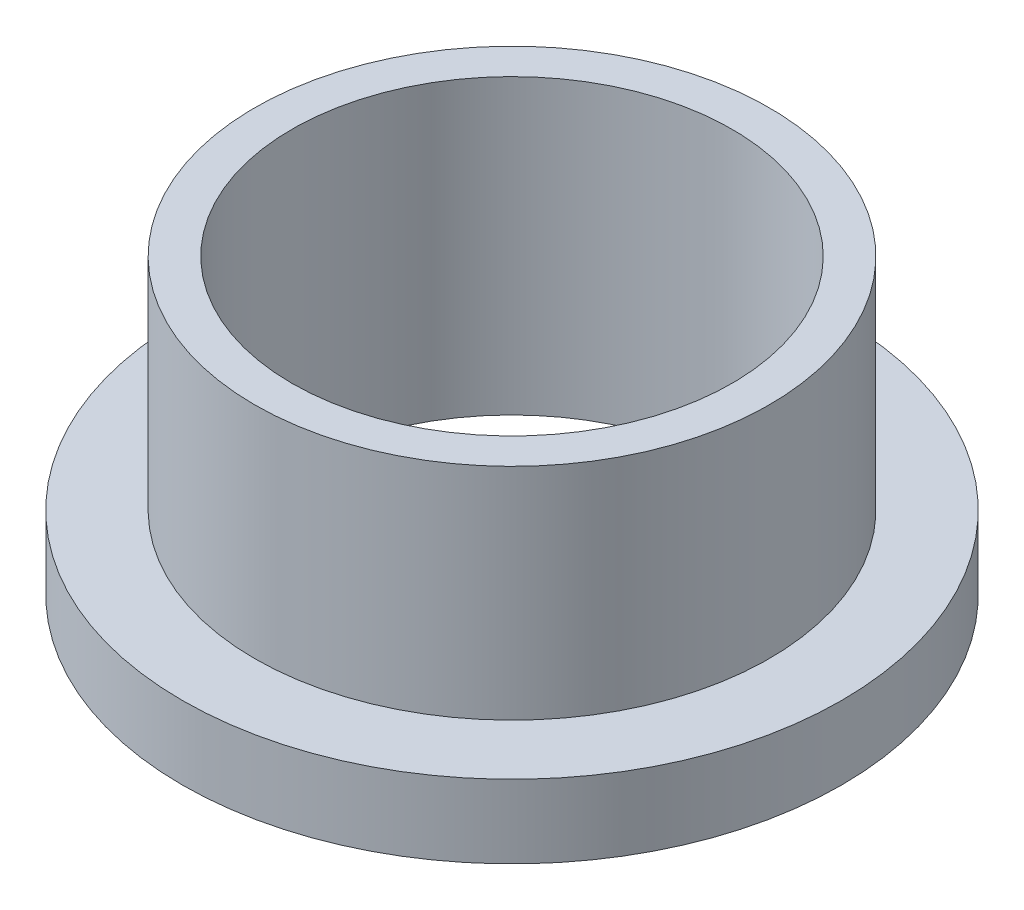
ISO-10303-21;
HEADER;
FILE_DESCRIPTION(('STEP AP214'),'2;1');
FILE_NAME('part.step','',(''),(''),'','','');
FILE_SCHEMA(('AUTOMOTIVE_DESIGN { 1 0 10303 214 1 1 1 1 }'));
ENDSEC;
DATA;
#1=APPLICATION_CONTEXT('core data for automotive mechanical design processes');
#2=APPLICATION_PROTOCOL_DEFINITION('international standard','automotive_design',2000,#1);
#3=PRODUCT_CONTEXT('',#1,'mechanical');
#4=PRODUCT('Part','Part','',(#3));
#5=PRODUCT_RELATED_PRODUCT_CATEGORY('part','',(#4));
#6=PRODUCT_DEFINITION_FORMATION('','',#4);
#7=PRODUCT_DEFINITION_CONTEXT('part definition',#1,'design');
#8=PRODUCT_DEFINITION('design','',#6,#7);
#9=PRODUCT_DEFINITION_SHAPE('','',#8);
#10=(LENGTH_UNIT() NAMED_UNIT(*) SI_UNIT(.MILLI.,.METRE.));
#11=(NAMED_UNIT(*) PLANE_ANGLE_UNIT() SI_UNIT($,.RADIAN.));
#12=(NAMED_UNIT(*) SI_UNIT($,.STERADIAN.) SOLID_ANGLE_UNIT());
#13=UNCERTAINTY_MEASURE_WITH_UNIT(LENGTH_MEASURE(1.E-05),#10,'distance_accuracy_value','');
#14=(GEOMETRIC_REPRESENTATION_CONTEXT(3) GLOBAL_UNCERTAINTY_ASSIGNED_CONTEXT((#13)) GLOBAL_UNIT_ASSIGNED_CONTEXT((#10,
#11,#12)) REPRESENTATION_CONTEXT('',''));
#15=CARTESIAN_POINT('',(0.,0.,0.));
#16=DIRECTION('',(0.,0.,1.));
#17=DIRECTION('',(1.,0.,0.));
#18=AXIS2_PLACEMENT_3D('',#15,#16,#17);
#19=CARTESIAN_POINT('',(0.,12.7,0.));
#20=DIRECTION('',(0.,1.,0.));
#21=DIRECTION('',(0.,0.,1.));
#22=AXIS2_PLACEMENT_3D('',#19,#20,#21);
#23=PLANE('',#22);
#24=CARTESIAN_POINT('',(0.,12.7,0.));
#25=DIRECTION('',(0.,1.,0.));
#26=DIRECTION('',(0.,0.,1.));
#27=AXIS2_PLACEMENT_3D('',#24,#25,#26);
#28=CIRCLE('',#27,11.1506);
#29=CARTESIAN_POINT('',(0.,12.7,11.1506));
#30=VERTEX_POINT('',#29);
#31=EDGE_CURVE('E10',#30,#30,#28,.T.);
#32=ORIENTED_EDGE('',*,*,#31,.T.);
#33=EDGE_LOOP('',(#32));
#34=FACE_BOUND('',#33,.T.);
#35=CARTESIAN_POINT('',(0.,12.7,0.));
#36=DIRECTION('',(0.,1.,0.));
#37=DIRECTION('',(0.,0.,1.));
#38=AXIS2_PLACEMENT_3D('',#35,#36,#37);
#39=CIRCLE('',#38,9.5377);
#40=CARTESIAN_POINT('',(0.,12.7,9.5377));
#41=VERTEX_POINT('',#40);
#42=EDGE_CURVE('E37',#41,#41,#39,.T.);
#43=ORIENTED_EDGE('',*,*,#42,.F.);
#44=EDGE_LOOP('',(#43));
#45=FACE_BOUND('',#44,.T.);
#46=ADVANCED_FACE('F30',(#34,#45),#23,.T.);
#47=CARTESIAN_POINT('',(0.,0.,0.));
#48=DIRECTION('',(0.,1.,0.));
#49=DIRECTION('',(0.,0.,1.));
#50=AXIS2_PLACEMENT_3D('',#47,#48,#49);
#51=PLANE('',#50);
#52=CARTESIAN_POINT('',(0.,0.,0.));
#53=DIRECTION('',(0.,1.,0.));
#54=DIRECTION('',(0.,0.,1.));
#55=AXIS2_PLACEMENT_3D('',#52,#53,#54);
#56=CIRCLE('',#55,9.5377);
#57=CARTESIAN_POINT('',(0.,0.,9.5377));
#58=VERTEX_POINT('',#57);
#59=EDGE_CURVE('E41',#58,#58,#56,.T.);
#60=ORIENTED_EDGE('',*,*,#59,.T.);
#61=EDGE_LOOP('',(#60));
#62=FACE_BOUND('',#61,.T.);
#63=CARTESIAN_POINT('',(0.,0.,0.));
#64=DIRECTION('',(0.,1.,0.));
#65=DIRECTION('',(0.,0.,1.));
#66=AXIS2_PLACEMENT_3D('',#63,#64,#65);
#67=CIRCLE('',#66,14.2875);
#68=CARTESIAN_POINT('',(0.,0.,14.2875));
#69=VERTEX_POINT('',#68);
#70=EDGE_CURVE('E48',#69,#69,#67,.T.);
#71=ORIENTED_EDGE('',*,*,#70,.F.);
#72=EDGE_LOOP('',(#71));
#73=FACE_BOUND('',#72,.T.);
#74=ADVANCED_FACE('F73',(#62,#73),#51,.F.);
#75=CARTESIAN_POINT('',(0.,12.7,0.));
#76=DIRECTION('',(0.,-1.,0.));
#77=DIRECTION('',(0.,0.,-1.));
#78=AXIS2_PLACEMENT_3D('',#75,#76,#77);
#79=CYLINDRICAL_SURFACE('',#78,11.1506);
#80=CARTESIAN_POINT('',(0.,3.175,0.));
#81=DIRECTION('',(0.,1.,0.));
#82=DIRECTION('',(0.,0.,1.));
#83=AXIS2_PLACEMENT_3D('',#80,#81,#82);
#84=CIRCLE('',#83,11.1506);
#85=CARTESIAN_POINT('',(0.,3.175,11.1506));
#86=VERTEX_POINT('',#85);
#87=EDGE_CURVE('E51',#86,#86,#84,.T.);
#88=ORIENTED_EDGE('',*,*,#87,.T.);
#89=EDGE_LOOP('',(#88));
#90=FACE_BOUND('',#89,.T.);
#91=ORIENTED_EDGE('',*,*,#31,.F.);
#92=EDGE_LOOP('',(#91));
#93=FACE_BOUND('',#92,.T.);
#94=ADVANCED_FACE('F32',(#90,#93),#79,.T.);
#95=CARTESIAN_POINT('',(0.,12.7,0.));
#96=DIRECTION('',(0.,-1.,0.));
#97=DIRECTION('',(0.,0.,-1.));
#98=AXIS2_PLACEMENT_3D('',#95,#96,#97);
#99=CYLINDRICAL_SURFACE('',#98,9.5377);
#100=ORIENTED_EDGE('',*,*,#42,.T.);
#101=EDGE_LOOP('',(#100));
#102=FACE_BOUND('',#101,.T.);
#103=ORIENTED_EDGE('',*,*,#59,.F.);
#104=EDGE_LOOP('',(#103));
#105=FACE_BOUND('',#104,.T.);
#106=ADVANCED_FACE('F62',(#102,#105),#99,.F.);
#107=CARTESIAN_POINT('',(0.,3.175,0.));
#108=DIRECTION('',(0.,1.,0.));
#109=DIRECTION('',(0.,0.,1.));
#110=AXIS2_PLACEMENT_3D('',#107,#108,#109);
#111=PLANE('',#110);
#112=CARTESIAN_POINT('',(0.,3.175,0.));
#113=DIRECTION('',(0.,1.,0.));
#114=DIRECTION('',(0.,0.,1.));
#115=AXIS2_PLACEMENT_3D('',#112,#113,#114);
#116=CIRCLE('',#115,14.2875);
#117=CARTESIAN_POINT('',(0.,3.175,14.2875));
#118=VERTEX_POINT('',#117);
#119=EDGE_CURVE('E46',#118,#118,#116,.T.);
#120=ORIENTED_EDGE('',*,*,#119,.T.);
#121=EDGE_LOOP('',(#120));
#122=FACE_BOUND('',#121,.T.);
#123=ORIENTED_EDGE('',*,*,#87,.F.);
#124=EDGE_LOOP('',(#123));
#125=FACE_BOUND('',#124,.T.);
#126=ADVANCED_FACE('F59',(#122,#125),#111,.T.);
#127=CARTESIAN_POINT('',(0.,3.175,0.));
#128=DIRECTION('',(0.,-1.,0.));
#129=DIRECTION('',(0.,0.,-1.));
#130=AXIS2_PLACEMENT_3D('',#127,#128,#129);
#131=CYLINDRICAL_SURFACE('',#130,14.2875);
#132=ORIENTED_EDGE('',*,*,#119,.F.);
#133=EDGE_LOOP('',(#132));
#134=FACE_BOUND('',#133,.T.);
#135=ORIENTED_EDGE('',*,*,#70,.T.);
#136=EDGE_LOOP('',(#135));
#137=FACE_BOUND('',#136,.T.);
#138=ADVANCED_FACE('F61',(#134,#137),#131,.T.);
#139=CLOSED_SHELL('',(#46,#74,#94,#106,#126,#138));
#140=MANIFOLD_SOLID_BREP('B2',#139);
#141=ADVANCED_BREP_SHAPE_REPRESENTATION('',(#18,#140),#14);
#142=SHAPE_DEFINITION_REPRESENTATION(#9,#141);
ENDSEC;
END-ISO-10303-21;
